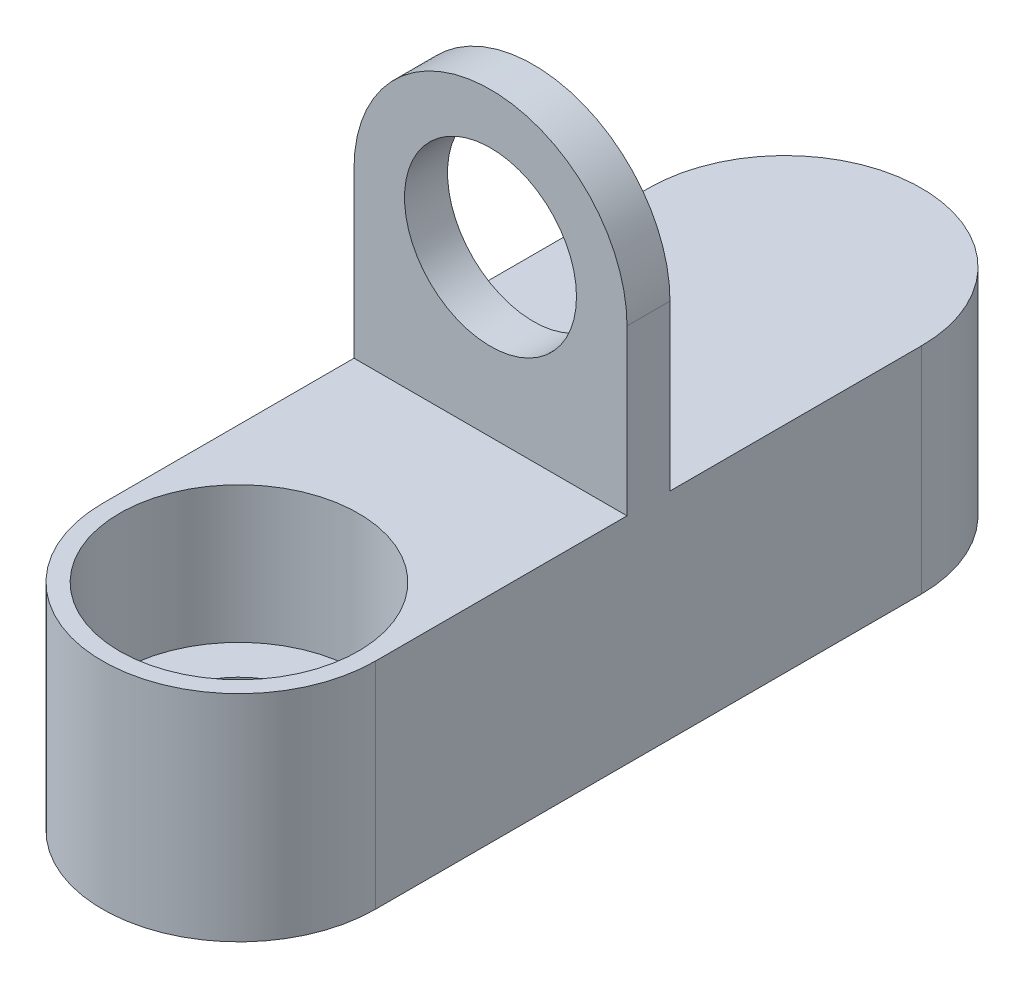
ISO-10303-21;
HEADER;
FILE_DESCRIPTION(('STEP AP214'),'2;1');
FILE_NAME('part.step','',(''),(''),'','','');
FILE_SCHEMA(('AUTOMOTIVE_DESIGN { 1 0 10303 214 1 1 1 1 }'));
ENDSEC;
DATA;
#1=APPLICATION_CONTEXT('core data for automotive mechanical design processes');
#2=APPLICATION_PROTOCOL_DEFINITION('international standard','automotive_design',2000,#1);
#3=PRODUCT_CONTEXT('',#1,'mechanical');
#4=PRODUCT('Part','Part','',(#3));
#5=PRODUCT_RELATED_PRODUCT_CATEGORY('part','',(#4));
#6=PRODUCT_DEFINITION_FORMATION('','',#4);
#7=PRODUCT_DEFINITION_CONTEXT('part definition',#1,'design');
#8=PRODUCT_DEFINITION('design','',#6,#7);
#9=PRODUCT_DEFINITION_SHAPE('','',#8);
#10=(LENGTH_UNIT() NAMED_UNIT(*) SI_UNIT(.MILLI.,.METRE.));
#11=(NAMED_UNIT(*) PLANE_ANGLE_UNIT() SI_UNIT($,.RADIAN.));
#12=(NAMED_UNIT(*) SI_UNIT($,.STERADIAN.) SOLID_ANGLE_UNIT());
#13=UNCERTAINTY_MEASURE_WITH_UNIT(LENGTH_MEASURE(1.E-05),#10,'distance_accuracy_value','');
#14=(GEOMETRIC_REPRESENTATION_CONTEXT(3) GLOBAL_UNCERTAINTY_ASSIGNED_CONTEXT((#13)) GLOBAL_UNIT_ASSIGNED_CONTEXT((#10,
#11,#12)) REPRESENTATION_CONTEXT('',''));
#15=CARTESIAN_POINT('',(0.,0.,0.));
#16=DIRECTION('',(0.,0.,1.));
#17=DIRECTION('',(1.,0.,0.));
#18=AXIS2_PLACEMENT_3D('',#15,#16,#17);
#19=CARTESIAN_POINT('',(-6.35,24.,-1.));
#20=DIRECTION('',(0.,0.,1.));
#21=DIRECTION('',(1.,0.,0.));
#22=AXIS2_PLACEMENT_3D('',#19,#20,#21);
#23=PLANE('',#22);
#24=CARTESIAN_POINT('',(0.,17.65,-1.));
#25=DIRECTION('',(0.,0.,1.));
#26=DIRECTION('',(1.,0.,0.));
#27=AXIS2_PLACEMENT_3D('',#24,#25,#26);
#28=CIRCLE('',#27,4.);
#29=CARTESIAN_POINT('',(4.,17.65,-1.));
#30=VERTEX_POINT('',#29);
#31=EDGE_CURVE('E114',#30,#30,#28,.T.);
#32=ORIENTED_EDGE('',*,*,#31,.T.);
#33=EDGE_LOOP('',(#32));
#34=FACE_BOUND('',#33,.T.);
#35=CARTESIAN_POINT('',(0.,17.65,-1.));
#36=DIRECTION('',(0.,0.,1.));
#37=DIRECTION('',(1.,0.,0.));
#38=AXIS2_PLACEMENT_3D('',#35,#36,#37);
#39=CIRCLE('',#38,6.35);
#40=CARTESIAN_POINT('',(6.35,17.65,-0.999999999999999));
#41=VERTEX_POINT('',#40);
#42=CARTESIAN_POINT('',(-6.35,17.65,-1.));
#43=VERTEX_POINT('',#42);
#44=EDGE_CURVE('E221',#41,#43,#39,.T.);
#45=ORIENTED_EDGE('',*,*,#44,.F.);
#46=DIRECTION('',(0.,-1.,0.));
#47=VECTOR('',#46,1.);
#48=CARTESIAN_POINT('',(6.35,24.,-1.));
#49=LINE('',#48,#47);
#50=CARTESIAN_POINT('',(6.35,10.,-1.));
#51=VERTEX_POINT('',#50);
#52=EDGE_CURVE('E55',#41,#51,#49,.T.);
#53=ORIENTED_EDGE('',*,*,#52,.T.);
#54=DIRECTION('',(-1.,0.,0.));
#55=VECTOR('',#54,1.);
#56=CARTESIAN_POINT('',(-6.35,10.,-1.));
#57=LINE('',#56,#55);
#58=CARTESIAN_POINT('',(-6.35,10.,-1.));
#59=VERTEX_POINT('',#58);
#60=EDGE_CURVE('E129',#51,#59,#57,.T.);
#61=ORIENTED_EDGE('',*,*,#60,.T.);
#62=DIRECTION('',(0.,-1.,0.));
#63=VECTOR('',#62,1.);
#64=CARTESIAN_POINT('',(-6.35,24.,-1.));
#65=LINE('',#64,#63);
#66=EDGE_CURVE('E127',#43,#59,#65,.T.);
#67=ORIENTED_EDGE('',*,*,#66,.F.);
#68=EDGE_LOOP('',(#45,#53,#61,#67));
#69=FACE_BOUND('',#68,.T.);
#70=ADVANCED_FACE('F39',(#34,#69),#23,.F.);
#71=CARTESIAN_POINT('',(-6.35,24.,1.));
#72=DIRECTION('',(0.,0.,-1.));
#73=DIRECTION('',(-1.,0.,0.));
#74=AXIS2_PLACEMENT_3D('',#71,#72,#73);
#75=PLANE('',#74);
#76=CARTESIAN_POINT('',(0.,17.65,1.));
#77=DIRECTION('',(0.,0.,1.));
#78=DIRECTION('',(1.,0.,0.));
#79=AXIS2_PLACEMENT_3D('',#76,#77,#78);
#80=CIRCLE('',#79,4.);
#81=CARTESIAN_POINT('',(4.,17.65,1.));
#82=VERTEX_POINT('',#81);
#83=EDGE_CURVE('E230',#82,#82,#80,.T.);
#84=ORIENTED_EDGE('',*,*,#83,.F.);
#85=EDGE_LOOP('',(#84));
#86=FACE_BOUND('',#85,.T.);
#87=DIRECTION('',(0.,-1.,0.));
#88=VECTOR('',#87,1.);
#89=CARTESIAN_POINT('',(6.35,24.,1.));
#90=LINE('',#89,#88);
#91=CARTESIAN_POINT('',(6.35,17.65,1.));
#92=VERTEX_POINT('',#91);
#93=CARTESIAN_POINT('',(6.35,10.,0.999999999999997));
#94=VERTEX_POINT('',#93);
#95=EDGE_CURVE('E62',#92,#94,#90,.T.);
#96=ORIENTED_EDGE('',*,*,#95,.F.);
#97=CARTESIAN_POINT('',(0.,17.65,1.));
#98=DIRECTION('',(0.,0.,1.));
#99=DIRECTION('',(1.,0.,0.));
#100=AXIS2_PLACEMENT_3D('',#97,#98,#99);
#101=CIRCLE('',#100,6.35);
#102=CARTESIAN_POINT('',(-6.35,17.65,1.));
#103=VERTEX_POINT('',#102);
#104=EDGE_CURVE('E107',#92,#103,#101,.T.);
#105=ORIENTED_EDGE('',*,*,#104,.T.);
#106=DIRECTION('',(0.,-1.,0.));
#107=VECTOR('',#106,1.);
#108=CARTESIAN_POINT('',(-6.35,24.,1.));
#109=LINE('',#108,#107);
#110=CARTESIAN_POINT('',(-6.35,10.,0.999999999999999));
#111=VERTEX_POINT('',#110);
#112=EDGE_CURVE('E123',#103,#111,#109,.T.);
#113=ORIENTED_EDGE('',*,*,#112,.T.);
#114=DIRECTION('',(1.,0.,0.));
#115=VECTOR('',#114,1.);
#116=CARTESIAN_POINT('',(-6.35,10.,1.));
#117=LINE('',#116,#115);
#118=EDGE_CURVE('E121',#111,#94,#117,.T.);
#119=ORIENTED_EDGE('',*,*,#118,.T.);
#120=EDGE_LOOP('',(#96,#105,#113,#119));
#121=FACE_BOUND('',#120,.T.);
#122=ADVANCED_FACE('F119',(#86,#121),#75,.F.);
#123=CARTESIAN_POINT('',(-6.35,10.,-12.7));
#124=DIRECTION('',(1.,0.,0.));
#125=DIRECTION('',(0.,0.,-1.));
#126=AXIS2_PLACEMENT_3D('',#123,#124,#125);
#127=PLANE('',#126);
#128=DIRECTION('',(0.,0.,1.));
#129=VECTOR('',#128,1.);
#130=CARTESIAN_POINT('',(-6.35,17.65,-9.));
#131=LINE('',#130,#129);
#132=EDGE_CURVE('E110',#43,#103,#131,.T.);
#133=ORIENTED_EDGE('',*,*,#132,.F.);
#134=ORIENTED_EDGE('',*,*,#66,.T.);
#135=DIRECTION('',(0.,0.,1.));
#136=VECTOR('',#135,1.);
#137=CARTESIAN_POINT('',(-6.35,10.,-12.7));
#138=LINE('',#137,#136);
#139=CARTESIAN_POINT('',(-6.35,10.,-12.7));
#140=VERTEX_POINT('',#139);
#141=EDGE_CURVE('E160',#140,#59,#138,.T.);
#142=ORIENTED_EDGE('',*,*,#141,.F.);
#143=DIRECTION('',(0.,-1.,0.));
#144=VECTOR('',#143,1.);
#145=CARTESIAN_POINT('',(-6.35,10.,-12.7));
#146=LINE('',#145,#144);
#147=CARTESIAN_POINT('',(-6.35,0.,-12.7));
#148=VERTEX_POINT('',#147);
#149=EDGE_CURVE('E48',#140,#148,#146,.T.);
#150=ORIENTED_EDGE('',*,*,#149,.T.);
#151=DIRECTION('',(0.,0.,1.));
#152=VECTOR('',#151,1.);
#153=CARTESIAN_POINT('',(-6.35,0.,-12.7));
#154=LINE('',#153,#152);
#155=CARTESIAN_POINT('',(-6.35,0.,12.7));
#156=VERTEX_POINT('',#155);
#157=EDGE_CURVE('E175',#148,#156,#154,.T.);
#158=ORIENTED_EDGE('',*,*,#157,.T.);
#159=DIRECTION('',(0.,-1.,0.));
#160=VECTOR('',#159,1.);
#161=CARTESIAN_POINT('',(-6.35,10.,12.7));
#162=LINE('',#161,#160);
#163=CARTESIAN_POINT('',(-6.35,10.,12.7));
#164=VERTEX_POINT('',#163);
#165=EDGE_CURVE('E190',#164,#156,#162,.T.);
#166=ORIENTED_EDGE('',*,*,#165,.F.);
#167=EDGE_CURVE('E158',#111,#164,#138,.T.);
#168=ORIENTED_EDGE('',*,*,#167,.F.);
#169=ORIENTED_EDGE('',*,*,#112,.F.);
#170=EDGE_LOOP('',(#133,#134,#142,#150,#158,#166,#168,#169));
#171=FACE_BOUND('',#170,.T.);
#172=ADVANCED_FACE('F197',(#171),#127,.F.);
#173=CARTESIAN_POINT('',(0.,10.,-12.7));
#174=DIRECTION('',(0.,1.,0.));
#175=DIRECTION('',(0.,0.,1.));
#176=AXIS2_PLACEMENT_3D('',#173,#174,#175);
#177=PLANE('',#176);
#178=ORIENTED_EDGE('',*,*,#118,.F.);
#179=ORIENTED_EDGE('',*,*,#167,.T.);
#180=CARTESIAN_POINT('',(0.,10.,12.7));
#181=DIRECTION('',(0.,1.,0.));
#182=DIRECTION('',(0.,0.,1.));
#183=AXIS2_PLACEMENT_3D('',#180,#181,#182);
#184=CIRCLE('',#183,6.35);
#185=CARTESIAN_POINT('',(6.35,10.,12.7));
#186=VERTEX_POINT('',#185);
#187=EDGE_CURVE('E164',#164,#186,#184,.T.);
#188=ORIENTED_EDGE('',*,*,#187,.T.);
#189=DIRECTION('',(0.,0.,-1.));
#190=VECTOR('',#189,1.);
#191=CARTESIAN_POINT('',(6.34999999999999,10.,-12.7));
#192=LINE('',#191,#190);
#193=EDGE_CURVE('E168',#186,#94,#192,.T.);
#194=ORIENTED_EDGE('',*,*,#193,.T.);
#195=EDGE_LOOP('',(#178,#179,#188,#194));
#196=FACE_BOUND('',#195,.T.);
#197=CARTESIAN_POINT('',(0.,10.,12.7));
#198=DIRECTION('',(0.,1.,0.));
#199=DIRECTION('',(0.,0.,1.));
#200=AXIS2_PLACEMENT_3D('',#197,#198,#199);
#201=CIRCLE('',#200,5.55625);
#202=CARTESIAN_POINT('',(0.,10.,18.25625));
#203=VERTEX_POINT('',#202);
#204=EDGE_CURVE('E137',#203,#203,#201,.T.);
#205=ORIENTED_EDGE('',*,*,#204,.F.);
#206=EDGE_LOOP('',(#205));
#207=FACE_BOUND('',#206,.T.);
#208=ADVANCED_FACE('F212',(#196,#207),#177,.T.);
#209=CARTESIAN_POINT('',(0.,10.,-12.7));
#210=DIRECTION('',(0.,-1.,0.));
#211=DIRECTION('',(0.,0.,-1.));
#212=AXIS2_PLACEMENT_3D('',#209,#210,#211);
#213=CYLINDRICAL_SURFACE('',#212,6.35);
#214=CARTESIAN_POINT('',(0.,0.,-12.7));
#215=DIRECTION('',(0.,1.,0.));
#216=DIRECTION('',(0.,0.,1.));
#217=AXIS2_PLACEMENT_3D('',#214,#215,#216);
#218=CIRCLE('',#217,6.35);
#219=CARTESIAN_POINT('',(6.34999999999999,0.,-12.7));
#220=VERTEX_POINT('',#219);
#221=EDGE_CURVE('E153',#220,#148,#218,.T.);
#222=ORIENTED_EDGE('',*,*,#221,.T.);
#223=ORIENTED_EDGE('',*,*,#149,.F.);
#224=CARTESIAN_POINT('',(0.,10.,-12.7));
#225=DIRECTION('',(0.,1.,0.));
#226=DIRECTION('',(0.,0.,1.));
#227=AXIS2_PLACEMENT_3D('',#224,#225,#226);
#228=CIRCLE('',#227,6.35);
#229=CARTESIAN_POINT('',(6.34999999999999,10.,-12.7));
#230=VERTEX_POINT('',#229);
#231=EDGE_CURVE('E154',#230,#140,#228,.T.);
#232=ORIENTED_EDGE('',*,*,#231,.F.);
#233=DIRECTION('',(0.,-1.,0.));
#234=VECTOR('',#233,1.);
#235=CARTESIAN_POINT('',(6.34999999999999,10.,-12.7));
#236=LINE('',#235,#234);
#237=EDGE_CURVE('E171',#230,#220,#236,.T.);
#238=ORIENTED_EDGE('',*,*,#237,.T.);
#239=EDGE_LOOP('',(#222,#223,#232,#238));
#240=FACE_BOUND('',#239,.T.);
#241=ADVANCED_FACE('F41',(#240),#213,.T.);
#242=CARTESIAN_POINT('',(0.,10.,12.7));
#243=DIRECTION('',(0.,-1.,0.));
#244=DIRECTION('',(0.,0.,-1.));
#245=AXIS2_PLACEMENT_3D('',#242,#243,#244);
#246=CYLINDRICAL_SURFACE('',#245,6.35);
#247=CARTESIAN_POINT('',(0.,0.,12.7));
#248=DIRECTION('',(0.,1.,0.));
#249=DIRECTION('',(0.,0.,1.));
#250=AXIS2_PLACEMENT_3D('',#247,#248,#249);
#251=CIRCLE('',#250,6.35);
#252=CARTESIAN_POINT('',(6.35,0.,12.7));
#253=VERTEX_POINT('',#252);
#254=EDGE_CURVE('E178',#156,#253,#251,.T.);
#255=ORIENTED_EDGE('',*,*,#254,.T.);
#256=DIRECTION('',(0.,-1.,0.));
#257=VECTOR('',#256,1.);
#258=CARTESIAN_POINT('',(6.35,10.,12.7));
#259=LINE('',#258,#257);
#260=EDGE_CURVE('E186',#186,#253,#259,.T.);
#261=ORIENTED_EDGE('',*,*,#260,.F.);
#262=ORIENTED_EDGE('',*,*,#187,.F.);
#263=ORIENTED_EDGE('',*,*,#165,.T.);
#264=EDGE_LOOP('',(#255,#261,#262,#263));
#265=FACE_BOUND('',#264,.T.);
#266=ADVANCED_FACE('F209',(#265),#246,.T.);
#267=CARTESIAN_POINT('',(6.34999999999999,10.,-12.7));
#268=DIRECTION('',(-1.,0.,0.));
#269=DIRECTION('',(0.,0.,1.));
#270=AXIS2_PLACEMENT_3D('',#267,#268,#269);
#271=PLANE('',#270);
#272=ORIENTED_EDGE('',*,*,#52,.F.);
#273=DIRECTION('',(0.,0.,1.));
#274=VECTOR('',#273,1.);
#275=CARTESIAN_POINT('',(6.35,17.65,-9.));
#276=LINE('',#275,#274);
#277=EDGE_CURVE('E11',#41,#92,#276,.T.);
#278=ORIENTED_EDGE('',*,*,#277,.T.);
#279=ORIENTED_EDGE('',*,*,#95,.T.);
#280=ORIENTED_EDGE('',*,*,#193,.F.);
#281=ORIENTED_EDGE('',*,*,#260,.T.);
#282=DIRECTION('',(0.,0.,-1.));
#283=VECTOR('',#282,1.);
#284=CARTESIAN_POINT('',(6.34999999999999,0.,-12.7));
#285=LINE('',#284,#283);
#286=EDGE_CURVE('E159',#253,#220,#285,.T.);
#287=ORIENTED_EDGE('',*,*,#286,.T.);
#288=ORIENTED_EDGE('',*,*,#237,.F.);
#289=EDGE_CURVE('E167',#51,#230,#192,.T.);
#290=ORIENTED_EDGE('',*,*,#289,.F.);
#291=EDGE_LOOP('',(#272,#278,#279,#280,#281,#287,#288,#290));
#292=FACE_BOUND('',#291,.T.);
#293=ADVANCED_FACE('F116',(#292),#271,.F.);
#294=ORIENTED_EDGE('',*,*,#60,.F.);
#295=ORIENTED_EDGE('',*,*,#289,.T.);
#296=ORIENTED_EDGE('',*,*,#231,.T.);
#297=ORIENTED_EDGE('',*,*,#141,.T.);
#298=EDGE_LOOP('',(#294,#295,#296,#297));
#299=FACE_BOUND('',#298,.T.);
#300=ADVANCED_FACE('F218',(#299),#177,.T.);
#301=CARTESIAN_POINT('',(0.,0.,-12.7));
#302=DIRECTION('',(0.,1.,0.));
#303=DIRECTION('',(0.,0.,1.));
#304=AXIS2_PLACEMENT_3D('',#301,#302,#303);
#305=PLANE('',#304);
#306=CARTESIAN_POINT('',(0.,0.,12.7));
#307=DIRECTION('',(0.,1.,0.));
#308=DIRECTION('',(0.,0.,1.));
#309=AXIS2_PLACEMENT_3D('',#306,#307,#308);
#310=CIRCLE('',#309,3.57124);
#311=CARTESIAN_POINT('',(0.,0.,16.27124));
#312=VERTEX_POINT('',#311);
#313=EDGE_CURVE('E149',#312,#312,#310,.T.);
#314=ORIENTED_EDGE('',*,*,#313,.T.);
#315=EDGE_LOOP('',(#314));
#316=FACE_BOUND('',#315,.T.);
#317=ORIENTED_EDGE('',*,*,#221,.F.);
#318=ORIENTED_EDGE('',*,*,#286,.F.);
#319=ORIENTED_EDGE('',*,*,#254,.F.);
#320=ORIENTED_EDGE('',*,*,#157,.F.);
#321=EDGE_LOOP('',(#317,#318,#319,#320));
#322=FACE_BOUND('',#321,.T.);
#323=ADVANCED_FACE('F205',(#316,#322),#305,.F.);
#324=CARTESIAN_POINT('',(0.,10.,12.7));
#325=DIRECTION('',(0.,1.,0.));
#326=DIRECTION('',(0.,0.,1.));
#327=AXIS2_PLACEMENT_3D('',#324,#325,#326);
#328=CYLINDRICAL_SURFACE('',#327,3.57124);
#329=ORIENTED_EDGE('',*,*,#313,.F.);
#330=EDGE_LOOP('',(#329));
#331=FACE_BOUND('',#330,.T.);
#332=CARTESIAN_POINT('',(0.,3.65,12.7));
#333=DIRECTION('',(0.,1.,0.));
#334=DIRECTION('',(0.,0.,1.));
#335=AXIS2_PLACEMENT_3D('',#332,#333,#334);
#336=CIRCLE('',#335,3.57124);
#337=CARTESIAN_POINT('',(0.,3.65,16.27124));
#338=VERTEX_POINT('',#337);
#339=EDGE_CURVE('E145',#338,#338,#336,.T.);
#340=ORIENTED_EDGE('',*,*,#339,.T.);
#341=EDGE_LOOP('',(#340));
#342=FACE_BOUND('',#341,.T.);
#343=ADVANCED_FACE('F256',(#331,#342),#328,.F.);
#344=CARTESIAN_POINT('',(3.57124,3.65,12.7));
#345=DIRECTION('',(0.,-1.,0.));
#346=DIRECTION('',(0.,0.,-1.));
#347=AXIS2_PLACEMENT_3D('',#344,#345,#346);
#348=PLANE('',#347);
#349=ORIENTED_EDGE('',*,*,#339,.F.);
#350=EDGE_LOOP('',(#349));
#351=FACE_BOUND('',#350,.T.);
#352=CARTESIAN_POINT('',(0.,3.65,12.7));
#353=DIRECTION('',(0.,1.,0.));
#354=DIRECTION('',(0.,0.,1.));
#355=AXIS2_PLACEMENT_3D('',#352,#353,#354);
#356=CIRCLE('',#355,5.55625);
#357=CARTESIAN_POINT('',(0.,3.65,18.25625));
#358=VERTEX_POINT('',#357);
#359=EDGE_CURVE('E141',#358,#358,#356,.T.);
#360=ORIENTED_EDGE('',*,*,#359,.T.);
#361=EDGE_LOOP('',(#360));
#362=FACE_BOUND('',#361,.T.);
#363=ADVANCED_FACE('F252',(#351,#362),#348,.F.);
#364=CARTESIAN_POINT('',(0.,10.,12.7));
#365=DIRECTION('',(0.,1.,0.));
#366=DIRECTION('',(0.,0.,1.));
#367=AXIS2_PLACEMENT_3D('',#364,#365,#366);
#368=CYLINDRICAL_SURFACE('',#367,5.55625);
#369=ORIENTED_EDGE('',*,*,#359,.F.);
#370=EDGE_LOOP('',(#369));
#371=FACE_BOUND('',#370,.T.);
#372=ORIENTED_EDGE('',*,*,#204,.T.);
#373=EDGE_LOOP('',(#372));
#374=FACE_BOUND('',#373,.T.);
#375=ADVANCED_FACE('F249',(#371,#374),#368,.F.);
#376=CARTESIAN_POINT('',(0.,17.65,-9.));
#377=DIRECTION('',(0.,0.,1.));
#378=DIRECTION('',(1.,0.,0.));
#379=AXIS2_PLACEMENT_3D('',#376,#377,#378);
#380=CYLINDRICAL_SURFACE('',#379,6.35);
#381=ORIENTED_EDGE('',*,*,#44,.T.);
#382=ORIENTED_EDGE('',*,*,#132,.T.);
#383=ORIENTED_EDGE('',*,*,#104,.F.);
#384=ORIENTED_EDGE('',*,*,#277,.F.);
#385=EDGE_LOOP('',(#381,#382,#383,#384));
#386=FACE_BOUND('',#385,.T.);
#387=ADVANCED_FACE('F108',(#386),#380,.T.);
#388=CARTESIAN_POINT('',(0.,17.65,-9.));
#389=DIRECTION('',(0.,0.,1.));
#390=DIRECTION('',(1.,0.,0.));
#391=AXIS2_PLACEMENT_3D('',#388,#389,#390);
#392=CYLINDRICAL_SURFACE('',#391,4.);
#393=ORIENTED_EDGE('',*,*,#83,.T.);
#394=EDGE_LOOP('',(#393));
#395=FACE_BOUND('',#394,.T.);
#396=ORIENTED_EDGE('',*,*,#31,.F.);
#397=EDGE_LOOP('',(#396));
#398=FACE_BOUND('',#397,.T.);
#399=ADVANCED_FACE('F235',(#395,#398),#392,.F.);
#400=CLOSED_SHELL('',(#70,#122,#172,#208,#241,#266,#293,#300,#323,#343,#363,#375,#387,#399));
#401=MANIFOLD_SOLID_BREP('B2',#400);
#402=ADVANCED_BREP_SHAPE_REPRESENTATION('',(#18,#401),#14);
#403=SHAPE_DEFINITION_REPRESENTATION(#9,#402);
ENDSEC;
END-ISO-10303-21;
